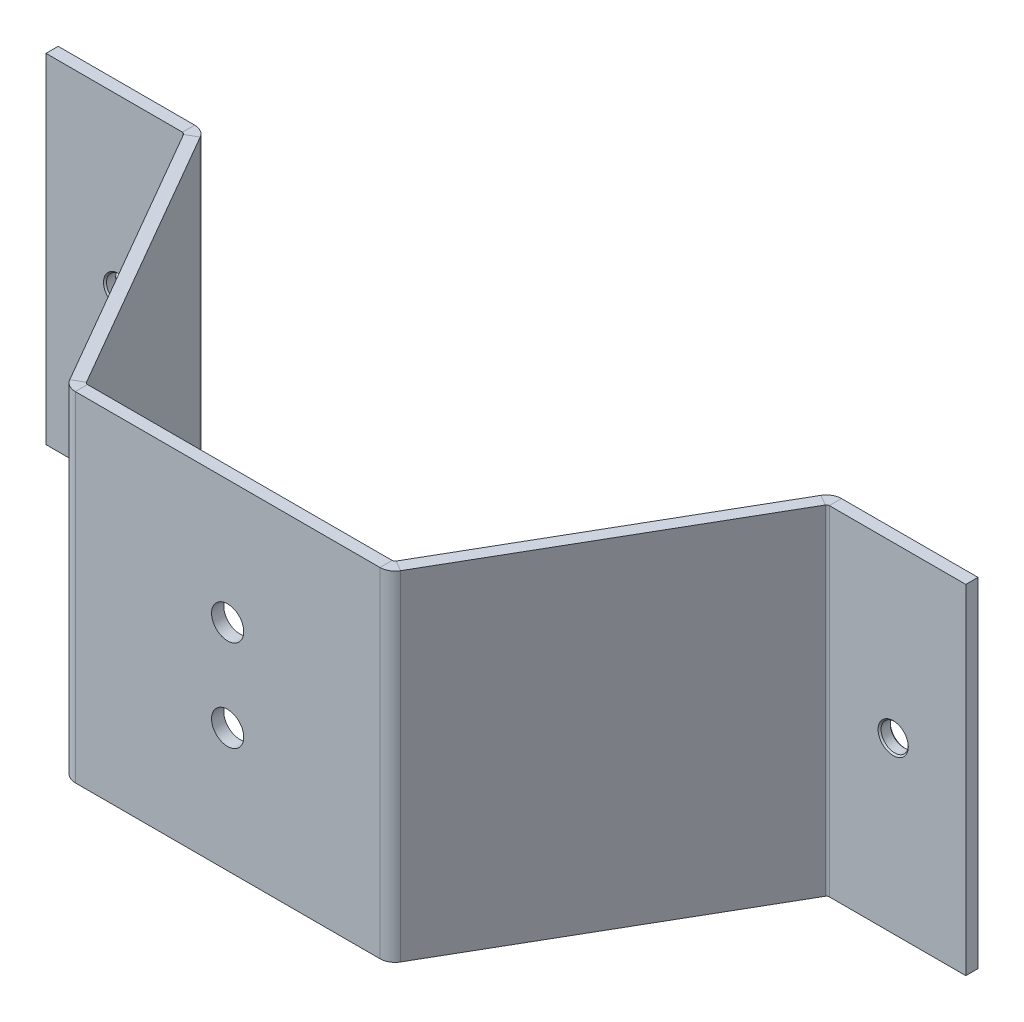
ISO-10303-21;
HEADER;
FILE_DESCRIPTION(('STEP AP214'),'2;1');
FILE_NAME('part.step','',(''),(''),'','','');
FILE_SCHEMA(('AUTOMOTIVE_DESIGN { 1 0 10303 214 1 1 1 1 }'));
ENDSEC;
DATA;
#1=APPLICATION_CONTEXT('core data for automotive mechanical design processes');
#2=APPLICATION_PROTOCOL_DEFINITION('international standard','automotive_design',2000,#1);
#3=PRODUCT_CONTEXT('',#1,'mechanical');
#4=PRODUCT('Part','Part','',(#3));
#5=PRODUCT_RELATED_PRODUCT_CATEGORY('part','',(#4));
#6=PRODUCT_DEFINITION_FORMATION('','',#4);
#7=PRODUCT_DEFINITION_CONTEXT('part definition',#1,'design');
#8=PRODUCT_DEFINITION('design','',#6,#7);
#9=PRODUCT_DEFINITION_SHAPE('','',#8);
#10=(LENGTH_UNIT() NAMED_UNIT(*) SI_UNIT(.MILLI.,.METRE.));
#11=(NAMED_UNIT(*) PLANE_ANGLE_UNIT() SI_UNIT($,.RADIAN.));
#12=(NAMED_UNIT(*) SI_UNIT($,.STERADIAN.) SOLID_ANGLE_UNIT());
#13=UNCERTAINTY_MEASURE_WITH_UNIT(LENGTH_MEASURE(1.E-05),#10,'distance_accuracy_value','');
#14=(GEOMETRIC_REPRESENTATION_CONTEXT(3) GLOBAL_UNCERTAINTY_ASSIGNED_CONTEXT((#13)) GLOBAL_UNIT_ASSIGNED_CONTEXT((#10,
#11,#12)) REPRESENTATION_CONTEXT('',''));
#15=CARTESIAN_POINT('',(0.,0.,0.));
#16=DIRECTION('',(0.,0.,1.));
#17=DIRECTION('',(1.,0.,0.));
#18=AXIS2_PLACEMENT_3D('',#15,#16,#17);
#19=CARTESIAN_POINT('',(20.2018306446326,22.225,38.1));
#20=DIRECTION('',(0.,0.,-1.));
#21=DIRECTION('',(-1.,0.,0.));
#22=AXIS2_PLACEMENT_3D('',#19,#20,#21);
#23=PLANE('',#22);
#24=CARTESIAN_POINT('',(0.,5.9944,38.1));
#25=DIRECTION('',(0.,0.,1.));
#26=DIRECTION('',(1.,0.,0.));
#27=AXIS2_PLACEMENT_3D('',#24,#25,#26);
#28=CIRCLE('',#27,2.1082);
#29=CARTESIAN_POINT('',(2.1082,5.9944,38.1));
#30=VERTEX_POINT('',#29);
#31=EDGE_CURVE('E1095',#30,#30,#28,.T.);
#32=ORIENTED_EDGE('',*,*,#31,.F.);
#33=EDGE_LOOP('',(#32));
#34=FACE_BOUND('',#33,.T.);
#35=DIRECTION('',(1.,0.,0.));
#36=VECTOR('',#35,1.);
#37=CARTESIAN_POINT('',(20.2018306446326,-22.225,38.1));
#38=LINE('',#37,#36);
#39=CARTESIAN_POINT('',(-19.9818601920714,-22.225,38.1));
#40=VERTEX_POINT('',#39);
#41=CARTESIAN_POINT('',(19.9818601920714,-22.225,38.1));
#42=VERTEX_POINT('',#41);
#43=EDGE_CURVE('E274',#40,#42,#38,.T.);
#44=ORIENTED_EDGE('',*,*,#43,.T.);
#45=DIRECTION('',(0.,-1.,0.));
#46=VECTOR('',#45,1.);
#47=CARTESIAN_POINT('',(19.9818601920714,22.225,38.1));
#48=LINE('',#47,#46);
#49=CARTESIAN_POINT('',(19.9818601920714,22.225,38.1));
#50=VERTEX_POINT('',#49);
#51=EDGE_CURVE('E215',#50,#42,#48,.T.);
#52=ORIENTED_EDGE('',*,*,#51,.F.);
#53=DIRECTION('',(1.,0.,0.));
#54=VECTOR('',#53,1.);
#55=CARTESIAN_POINT('',(20.2018306446326,22.225,38.1));
#56=LINE('',#55,#54);
#57=CARTESIAN_POINT('',(-19.9818601920714,22.225,38.1));
#58=VERTEX_POINT('',#57);
#59=EDGE_CURVE('E206',#58,#50,#56,.T.);
#60=ORIENTED_EDGE('',*,*,#59,.F.);
#61=DIRECTION('',(0.,-1.,0.));
#62=VECTOR('',#61,1.);
#63=CARTESIAN_POINT('',(-19.9818601920714,22.225,38.1));
#64=LINE('',#63,#62);
#65=EDGE_CURVE('E286',#58,#40,#64,.T.);
#66=ORIENTED_EDGE('',*,*,#65,.T.);
#67=EDGE_LOOP('',(#44,#52,#60,#66));
#68=FACE_BOUND('',#67,.T.);
#69=CARTESIAN_POINT('',(0.,-5.9944,38.1));
#70=DIRECTION('',(0.,0.,1.));
#71=DIRECTION('',(1.,0.,0.));
#72=AXIS2_PLACEMENT_3D('',#69,#70,#71);
#73=CIRCLE('',#72,2.1082);
#74=CARTESIAN_POINT('',(2.1082,-5.9944,38.1));
#75=VERTEX_POINT('',#74);
#76=EDGE_CURVE('E1099',#75,#75,#73,.T.);
#77=ORIENTED_EDGE('',*,*,#76,.F.);
#78=EDGE_LOOP('',(#77));
#79=FACE_BOUND('',#78,.T.);
#80=ADVANCED_FACE('F40',(#34,#68,#79),#23,.F.);
#81=CARTESIAN_POINT('',(42.4188463533185,22.225,0.));
#82=DIRECTION('',(0.,1.,0.));
#83=DIRECTION('',(0.,0.,1.));
#84=AXIS2_PLACEMENT_3D('',#81,#82,#83);
#85=PLANE('',#84);
#86=DIRECTION('',(0.,0.,1.));
#87=VECTOR('',#86,1.);
#88=CARTESIAN_POINT('',(42.4188463533185,22.225,0.));
#89=LINE('',#88,#87);
#90=CARTESIAN_POINT('',(42.4188463533185,22.225,0.));
#91=VERTEX_POINT('',#90);
#92=CARTESIAN_POINT('',(42.4188463533185,22.225,1.60020000000001));
#93=VERTEX_POINT('',#92);
#94=EDGE_CURVE('E11',#91,#93,#89,.T.);
#95=ORIENTED_EDGE('',*,*,#94,.F.);
#96=CARTESIAN_POINT('',(42.4188463533185,22.225,1.98120000000001));
#97=DIRECTION('',(0.,-1.,0.));
#98=DIRECTION('',(0.,0.,-1.));
#99=AXIS2_PLACEMENT_3D('',#96,#97,#98);
#100=CIRCLE('',#99,1.9812);
#101=CARTESIAN_POINT('',(40.7030768233408,22.225,0.99060000000001));
#102=VERTEX_POINT('',#101);
#103=EDGE_CURVE('E359',#102,#91,#100,.T.);
#104=ORIENTED_EDGE('',*,*,#103,.F.);
#105=DIRECTION('',(-0.866025403784439,0.,-0.499999999999999));
#106=VECTOR('',#105,1.);
#107=CARTESIAN_POINT('',(42.0888906744766,22.225,1.79070000000001));
#108=LINE('',#107,#106);
#109=CARTESIAN_POINT('',(42.0888906744766,22.225,1.79070000000001));
#110=VERTEX_POINT('',#109);
#111=EDGE_CURVE('E49',#110,#102,#108,.T.);
#112=ORIENTED_EDGE('',*,*,#111,.F.);
#113=CARTESIAN_POINT('',(42.4188463533185,22.225,1.98120000000001));
#114=DIRECTION('',(0.,1.,0.));
#115=DIRECTION('',(1.,0.,0.));
#116=AXIS2_PLACEMENT_3D('',#113,#114,#115);
#117=CIRCLE('',#116,0.381);
#118=EDGE_CURVE('E221',#110,#93,#117,.F.);
#119=ORIENTED_EDGE('',*,*,#118,.T.);
#120=EDGE_LOOP('',(#95,#104,#112,#119));
#121=FACE_BOUND('',#120,.T.);
#122=ADVANCED_FACE('F42',(#121),#85,.T.);
#123=CARTESIAN_POINT('',(42.0888906744766,22.225,1.79070000000001));
#124=DIRECTION('',(0.,1.,0.));
#125=DIRECTION('',(0.,0.,1.));
#126=AXIS2_PLACEMENT_3D('',#123,#124,#125);
#127=PLANE('',#126);
#128=DIRECTION('',(1.,0.,0.));
#129=VECTOR('',#128,1.);
#130=CARTESIAN_POINT('',(60.325,22.225,0.));
#131=LINE('',#130,#129);
#132=CARTESIAN_POINT('',(60.325,22.225,0.));
#133=VERTEX_POINT('',#132);
#134=EDGE_CURVE('E363',#91,#133,#131,.T.);
#135=ORIENTED_EDGE('',*,*,#134,.F.);
#136=ORIENTED_EDGE('',*,*,#94,.T.);
#137=DIRECTION('',(1.,0.,0.));
#138=VECTOR('',#137,1.);
#139=CARTESIAN_POINT('',(60.325,22.225,1.60020000000001));
#140=LINE('',#139,#138);
#141=CARTESIAN_POINT('',(60.325,22.225,1.60020000000001));
#142=VERTEX_POINT('',#141);
#143=EDGE_CURVE('E133',#93,#142,#140,.T.);
#144=ORIENTED_EDGE('',*,*,#143,.T.);
#145=DIRECTION('',(0.,0.,1.));
#146=VECTOR('',#145,1.);
#147=CARTESIAN_POINT('',(60.325,22.225,0.));
#148=LINE('',#147,#146);
#149=EDGE_CURVE('E556',#133,#142,#148,.T.);
#150=ORIENTED_EDGE('',*,*,#149,.F.);
#151=EDGE_LOOP('',(#135,#136,#144,#150));
#152=FACE_BOUND('',#151,.T.);
#153=ADVANCED_FACE('F501',(#152),#127,.T.);
#154=CARTESIAN_POINT('',(40.7030768233408,-22.225,0.99060000000001));
#155=DIRECTION('',(0.,-1.,0.));
#156=DIRECTION('',(0.,0.,-1.));
#157=AXIS2_PLACEMENT_3D('',#154,#155,#156);
#158=PLANE('',#157);
#159=DIRECTION('',(0.866025403784439,0.,0.499999999999999));
#160=VECTOR('',#159,1.);
#161=CARTESIAN_POINT('',(40.7030768233408,-22.225,0.99060000000001));
#162=LINE('',#161,#160);
#163=CARTESIAN_POINT('',(40.7030768233408,-22.225,0.99060000000001));
#164=VERTEX_POINT('',#163);
#165=CARTESIAN_POINT('',(42.0888906744766,-22.225,1.79070000000001));
#166=VERTEX_POINT('',#165);
#167=EDGE_CURVE('E120',#164,#166,#162,.T.);
#168=ORIENTED_EDGE('',*,*,#167,.F.);
#169=CARTESIAN_POINT('',(42.4188463533185,-22.225,1.98120000000001));
#170=DIRECTION('',(0.,-1.,0.));
#171=DIRECTION('',(0.,0.,-1.));
#172=AXIS2_PLACEMENT_3D('',#169,#170,#171);
#173=CIRCLE('',#172,1.9812);
#174=CARTESIAN_POINT('',(42.4188463533185,-22.225,0.));
#175=VERTEX_POINT('',#174);
#176=EDGE_CURVE('E237',#164,#175,#173,.T.);
#177=ORIENTED_EDGE('',*,*,#176,.T.);
#178=DIRECTION('',(0.,0.,-1.));
#179=VECTOR('',#178,1.);
#180=CARTESIAN_POINT('',(42.4188463533185,-22.225,1.60020000000001));
#181=LINE('',#180,#179);
#182=CARTESIAN_POINT('',(42.4188463533185,-22.225,1.60020000000001));
#183=VERTEX_POINT('',#182);
#184=EDGE_CURVE('E127',#183,#175,#181,.T.);
#185=ORIENTED_EDGE('',*,*,#184,.F.);
#186=CARTESIAN_POINT('',(42.4188463533185,-22.225,1.98120000000001));
#187=DIRECTION('',(0.,1.,0.));
#188=DIRECTION('',(1.,0.,0.));
#189=AXIS2_PLACEMENT_3D('',#186,#187,#188);
#190=CIRCLE('',#189,0.381);
#191=EDGE_CURVE('E280',#166,#183,#190,.F.);
#192=ORIENTED_EDGE('',*,*,#191,.F.);
#193=EDGE_LOOP('',(#168,#177,#185,#192));
#194=FACE_BOUND('',#193,.T.);
#195=ADVANCED_FACE('F551',(#194),#158,.T.);
#196=CARTESIAN_POINT('',(42.4188463533185,-22.225,1.60020000000001));
#197=DIRECTION('',(0.,-1.,0.));
#198=DIRECTION('',(0.,0.,-1.));
#199=AXIS2_PLACEMENT_3D('',#196,#197,#198);
#200=PLANE('',#199);
#201=DIRECTION('',(0.499999999999998,0.,-0.86602540378444));
#202=VECTOR('',#201,1.);
#203=CARTESIAN_POINT('',(41.275,-22.225,0.));
#204=LINE('',#203,#202);
#205=CARTESIAN_POINT('',(20.3118158709133,-22.225,36.3093));
#206=VERTEX_POINT('',#205);
#207=EDGE_CURVE('E239',#206,#164,#204,.T.);
#208=ORIENTED_EDGE('',*,*,#207,.T.);
#209=ORIENTED_EDGE('',*,*,#167,.T.);
#210=DIRECTION('',(0.499999999999998,0.,-0.86602540378444));
#211=VECTOR('',#210,1.);
#212=CARTESIAN_POINT('',(42.6608138511359,-22.225,0.800100000000006));
#213=LINE('',#212,#211);
#214=CARTESIAN_POINT('',(21.6976297220491,-22.225,37.1094));
#215=VERTEX_POINT('',#214);
#216=EDGE_CURVE('E278',#215,#166,#213,.T.);
#217=ORIENTED_EDGE('',*,*,#216,.F.);
#218=DIRECTION('',(-0.86602540378444,0.,-0.499999999999998));
#219=VECTOR('',#218,1.);
#220=CARTESIAN_POINT('',(21.6976297220491,-22.225,37.1094));
#221=LINE('',#220,#219);
#222=EDGE_CURVE('E346',#215,#206,#221,.T.);
#223=ORIENTED_EDGE('',*,*,#222,.T.);
#224=EDGE_LOOP('',(#208,#209,#217,#223));
#225=FACE_BOUND('',#224,.T.);
#226=ADVANCED_FACE('F416',(#225),#200,.T.);
#227=CARTESIAN_POINT('',(20.3118158709133,22.225,36.3093));
#228=DIRECTION('',(0.,1.,0.));
#229=DIRECTION('',(0.,0.,1.));
#230=AXIS2_PLACEMENT_3D('',#227,#228,#229);
#231=PLANE('',#230);
#232=DIRECTION('',(0.86602540378444,0.,0.499999999999998));
#233=VECTOR('',#232,1.);
#234=CARTESIAN_POINT('',(20.3118158709133,22.225,36.3093));
#235=LINE('',#234,#233);
#236=CARTESIAN_POINT('',(20.3118158709133,22.225,36.3093));
#237=VERTEX_POINT('',#236);
#238=CARTESIAN_POINT('',(21.6976297220491,22.225,37.1094));
#239=VERTEX_POINT('',#238);
#240=EDGE_CURVE('E185',#237,#239,#235,.T.);
#241=ORIENTED_EDGE('',*,*,#240,.F.);
#242=CARTESIAN_POINT('',(19.9818601920714,22.225,36.1188));
#243=DIRECTION('',(0.,1.,0.));
#244=DIRECTION('',(0.,0.,1.));
#245=AXIS2_PLACEMENT_3D('',#242,#243,#244);
#246=CIRCLE('',#245,0.381);
#247=CARTESIAN_POINT('',(19.9818601920714,22.225,36.4998));
#248=VERTEX_POINT('',#247);
#249=EDGE_CURVE('E366',#248,#237,#246,.T.);
#250=ORIENTED_EDGE('',*,*,#249,.F.);
#251=DIRECTION('',(0.,0.,-1.));
#252=VECTOR('',#251,1.);
#253=CARTESIAN_POINT('',(19.9818601920714,22.225,38.1));
#254=LINE('',#253,#252);
#255=EDGE_CURVE('E197',#50,#248,#254,.T.);
#256=ORIENTED_EDGE('',*,*,#255,.F.);
#257=CARTESIAN_POINT('',(19.9818601920714,22.225,36.1188));
#258=DIRECTION('',(0.,1.,0.));
#259=DIRECTION('',(1.,0.,0.));
#260=AXIS2_PLACEMENT_3D('',#257,#258,#259);
#261=CIRCLE('',#260,1.9812);
#262=EDGE_CURVE('E200',#50,#239,#261,.T.);
#263=ORIENTED_EDGE('',*,*,#262,.T.);
#264=EDGE_LOOP('',(#241,#250,#256,#263));
#265=FACE_BOUND('',#264,.T.);
#266=ADVANCED_FACE('F202',(#265),#231,.T.);
#267=CARTESIAN_POINT('',(19.9818601920714,22.225,38.1));
#268=DIRECTION('',(0.,1.,0.));
#269=DIRECTION('',(0.,0.,1.));
#270=AXIS2_PLACEMENT_3D('',#267,#268,#269);
#271=PLANE('',#270);
#272=DIRECTION('',(0.499999999999998,0.,-0.86602540378444));
#273=VECTOR('',#272,1.);
#274=CARTESIAN_POINT('',(41.275,22.225,0.));
#275=LINE('',#274,#273);
#276=EDGE_CURVE('E192',#237,#102,#275,.T.);
#277=ORIENTED_EDGE('',*,*,#276,.F.);
#278=ORIENTED_EDGE('',*,*,#240,.T.);
#279=DIRECTION('',(0.499999999999998,0.,-0.86602540378444));
#280=VECTOR('',#279,1.);
#281=CARTESIAN_POINT('',(42.6608138511359,22.225,0.800100000000006));
#282=LINE('',#281,#280);
#283=EDGE_CURVE('E189',#239,#110,#282,.T.);
#284=ORIENTED_EDGE('',*,*,#283,.T.);
#285=ORIENTED_EDGE('',*,*,#111,.T.);
#286=EDGE_LOOP('',(#277,#278,#284,#285));
#287=FACE_BOUND('',#286,.T.);
#288=ADVANCED_FACE('F187',(#287),#271,.T.);
#289=CARTESIAN_POINT('',(19.9818601920714,-22.225,36.4998));
#290=DIRECTION('',(0.,-1.,0.));
#291=DIRECTION('',(0.,0.,-1.));
#292=AXIS2_PLACEMENT_3D('',#289,#290,#291);
#293=PLANE('',#292);
#294=DIRECTION('',(0.,0.,1.));
#295=VECTOR('',#294,1.);
#296=CARTESIAN_POINT('',(19.9818601920714,-22.225,36.4998));
#297=LINE('',#296,#295);
#298=CARTESIAN_POINT('',(19.9818601920714,-22.225,36.4998));
#299=VERTEX_POINT('',#298);
#300=EDGE_CURVE('E348',#299,#42,#297,.T.);
#301=ORIENTED_EDGE('',*,*,#300,.F.);
#302=CARTESIAN_POINT('',(19.9818601920714,-22.225,36.1188));
#303=DIRECTION('',(0.,1.,0.));
#304=DIRECTION('',(0.,0.,1.));
#305=AXIS2_PLACEMENT_3D('',#302,#303,#304);
#306=CIRCLE('',#305,0.381);
#307=EDGE_CURVE('E241',#299,#206,#306,.T.);
#308=ORIENTED_EDGE('',*,*,#307,.T.);
#309=ORIENTED_EDGE('',*,*,#222,.F.);
#310=CARTESIAN_POINT('',(19.9818601920714,-22.225,36.1188));
#311=DIRECTION('',(0.,1.,0.));
#312=DIRECTION('',(1.,0.,0.));
#313=AXIS2_PLACEMENT_3D('',#310,#311,#312);
#314=CIRCLE('',#313,1.9812);
#315=EDGE_CURVE('E213',#42,#215,#314,.T.);
#316=ORIENTED_EDGE('',*,*,#315,.F.);
#317=EDGE_LOOP('',(#301,#308,#309,#316));
#318=FACE_BOUND('',#317,.T.);
#319=ADVANCED_FACE('F414',(#318),#293,.T.);
#320=CARTESIAN_POINT('',(21.6976297220491,-22.225,37.1094));
#321=DIRECTION('',(0.,-1.,0.));
#322=DIRECTION('',(0.,0.,-1.));
#323=AXIS2_PLACEMENT_3D('',#320,#321,#322);
#324=PLANE('',#323);
#325=DIRECTION('',(1.,0.,0.));
#326=VECTOR('',#325,1.);
#327=CARTESIAN_POINT('',(20.2018306446326,-22.225,36.4998));
#328=LINE('',#327,#326);
#329=CARTESIAN_POINT('',(-19.9818601920714,-22.225,36.4998));
#330=VERTEX_POINT('',#329);
#331=EDGE_CURVE('E244',#330,#299,#328,.T.);
#332=ORIENTED_EDGE('',*,*,#331,.T.);
#333=ORIENTED_EDGE('',*,*,#300,.T.);
#334=ORIENTED_EDGE('',*,*,#43,.F.);
#335=DIRECTION('',(0.,0.,-1.));
#336=VECTOR('',#335,1.);
#337=CARTESIAN_POINT('',(-19.9818601920714,-22.225,38.1));
#338=LINE('',#337,#336);
#339=EDGE_CURVE('E338',#40,#330,#338,.T.);
#340=ORIENTED_EDGE('',*,*,#339,.T.);
#341=EDGE_LOOP('',(#332,#333,#334,#340));
#342=FACE_BOUND('',#341,.T.);
#343=ADVANCED_FACE('F475',(#342),#324,.T.);
#344=CARTESIAN_POINT('',(-19.9818601920714,22.225,36.4998));
#345=DIRECTION('',(0.,1.,0.));
#346=DIRECTION('',(0.,0.,1.));
#347=AXIS2_PLACEMENT_3D('',#344,#345,#346);
#348=PLANE('',#347);
#349=DIRECTION('',(0.,0.,1.));
#350=VECTOR('',#349,1.);
#351=CARTESIAN_POINT('',(-19.9818601920714,22.225,36.4998));
#352=LINE('',#351,#350);
#353=CARTESIAN_POINT('',(-19.9818601920714,22.225,36.4998));
#354=VERTEX_POINT('',#353);
#355=EDGE_CURVE('E344',#354,#58,#352,.T.);
#356=ORIENTED_EDGE('',*,*,#355,.F.);
#357=CARTESIAN_POINT('',(-19.9818601920714,22.225,36.1188));
#358=DIRECTION('',(0.,1.,0.));
#359=DIRECTION('',(0.,0.,1.));
#360=AXIS2_PLACEMENT_3D('',#357,#358,#359);
#361=CIRCLE('',#360,0.381);
#362=CARTESIAN_POINT('',(-20.3118158709133,22.225,36.3093));
#363=VERTEX_POINT('',#362);
#364=EDGE_CURVE('E374',#363,#354,#361,.T.);
#365=ORIENTED_EDGE('',*,*,#364,.F.);
#366=DIRECTION('',(0.866025403784422,0.,-0.500000000000028));
#367=VECTOR('',#366,1.);
#368=CARTESIAN_POINT('',(-21.6976297220491,22.225,37.1094000000001));
#369=LINE('',#368,#367);
#370=CARTESIAN_POINT('',(-21.6976297220491,22.225,37.1094000000001));
#371=VERTEX_POINT('',#370);
#372=EDGE_CURVE('E342',#371,#363,#369,.T.);
#373=ORIENTED_EDGE('',*,*,#372,.F.);
#374=CARTESIAN_POINT('',(-19.9818601920714,22.225,36.1188));
#375=DIRECTION('',(0.,1.,0.));
#376=DIRECTION('',(1.,0.,0.));
#377=AXIS2_PLACEMENT_3D('',#374,#375,#376);
#378=CIRCLE('',#377,1.9812);
#379=EDGE_CURVE('E398',#371,#58,#378,.T.);
#380=ORIENTED_EDGE('',*,*,#379,.T.);
#381=EDGE_LOOP('',(#356,#365,#373,#380));
#382=FACE_BOUND('',#381,.T.);
#383=ADVANCED_FACE('F429',(#382),#348,.T.);
#384=CARTESIAN_POINT('',(-21.6976297220491,22.225,37.1094000000001));
#385=DIRECTION('',(0.,1.,0.));
#386=DIRECTION('',(0.,0.,1.));
#387=AXIS2_PLACEMENT_3D('',#384,#385,#386);
#388=PLANE('',#387);
#389=DIRECTION('',(1.,0.,0.));
#390=VECTOR('',#389,1.);
#391=CARTESIAN_POINT('',(20.2018306446326,22.225,36.4998));
#392=LINE('',#391,#390);
#393=EDGE_CURVE('E368',#354,#248,#392,.T.);
#394=ORIENTED_EDGE('',*,*,#393,.F.);
#395=ORIENTED_EDGE('',*,*,#355,.T.);
#396=ORIENTED_EDGE('',*,*,#59,.T.);
#397=ORIENTED_EDGE('',*,*,#255,.T.);
#398=EDGE_LOOP('',(#394,#395,#396,#397));
#399=FACE_BOUND('',#398,.T.);
#400=ADVANCED_FACE('F408',(#399),#388,.T.);
#401=CARTESIAN_POINT('',(-20.3118158709133,-22.225,36.3093));
#402=DIRECTION('',(0.,-1.,0.));
#403=DIRECTION('',(0.,0.,-1.));
#404=AXIS2_PLACEMENT_3D('',#401,#402,#403);
#405=PLANE('',#404);
#406=DIRECTION('',(-0.866025403784422,0.,0.500000000000028));
#407=VECTOR('',#406,1.);
#408=CARTESIAN_POINT('',(-20.3118158709133,-22.225,36.3093));
#409=LINE('',#408,#407);
#410=CARTESIAN_POINT('',(-20.3118158709133,-22.225,36.3093));
#411=VERTEX_POINT('',#410);
#412=CARTESIAN_POINT('',(-21.6976297220491,-22.225,37.1094000000001));
#413=VERTEX_POINT('',#412);
#414=EDGE_CURVE('E340',#411,#413,#409,.T.);
#415=ORIENTED_EDGE('',*,*,#414,.F.);
#416=CARTESIAN_POINT('',(-19.9818601920714,-22.225,36.1188));
#417=DIRECTION('',(0.,1.,0.));
#418=DIRECTION('',(0.,0.,1.));
#419=AXIS2_PLACEMENT_3D('',#416,#417,#418);
#420=CIRCLE('',#419,0.381);
#421=EDGE_CURVE('E247',#411,#330,#420,.T.);
#422=ORIENTED_EDGE('',*,*,#421,.T.);
#423=ORIENTED_EDGE('',*,*,#339,.F.);
#424=CARTESIAN_POINT('',(-19.9818601920714,-22.225,36.1188));
#425=DIRECTION('',(0.,1.,0.));
#426=DIRECTION('',(1.,0.,0.));
#427=AXIS2_PLACEMENT_3D('',#424,#425,#426);
#428=CIRCLE('',#427,1.9812);
#429=EDGE_CURVE('E271',#413,#40,#428,.T.);
#430=ORIENTED_EDGE('',*,*,#429,.F.);
#431=EDGE_LOOP('',(#415,#422,#423,#430));
#432=FACE_BOUND('',#431,.T.);
#433=ADVANCED_FACE('F477',(#432),#405,.T.);
#434=CARTESIAN_POINT('',(-19.9818601920714,-22.225,38.1));
#435=DIRECTION('',(0.,-1.,0.));
#436=DIRECTION('',(0.,0.,-1.));
#437=AXIS2_PLACEMENT_3D('',#434,#435,#436);
#438=PLANE('',#437);
#439=DIRECTION('',(0.499999999999998,0.,0.86602540378444));
#440=VECTOR('',#439,1.);
#441=CARTESIAN_POINT('',(-41.275,-22.225,0.));
#442=LINE('',#441,#440);
#443=CARTESIAN_POINT('',(-40.7030768233408,-22.225,0.99060000000001));
#444=VERTEX_POINT('',#443);
#445=EDGE_CURVE('E250',#444,#411,#442,.T.);
#446=ORIENTED_EDGE('',*,*,#445,.T.);
#447=ORIENTED_EDGE('',*,*,#414,.T.);
#448=DIRECTION('',(0.499999999999998,0.,0.86602540378444));
#449=VECTOR('',#448,1.);
#450=CARTESIAN_POINT('',(-42.6608138511359,-22.225,0.800100000000006));
#451=LINE('',#450,#449);
#452=CARTESIAN_POINT('',(-42.0888906744766,-22.225,1.79070000000001));
#453=VERTEX_POINT('',#452);
#454=EDGE_CURVE('E268',#453,#413,#451,.T.);
#455=ORIENTED_EDGE('',*,*,#454,.F.);
#456=DIRECTION('',(0.86602540378444,0.,-0.499999999999997));
#457=VECTOR('',#456,1.);
#458=CARTESIAN_POINT('',(-42.0888906744766,-22.225,1.79070000000001));
#459=LINE('',#458,#457);
#460=EDGE_CURVE('E330',#453,#444,#459,.T.);
#461=ORIENTED_EDGE('',*,*,#460,.T.);
#462=EDGE_LOOP('',(#446,#447,#455,#461));
#463=FACE_BOUND('',#462,.T.);
#464=ADVANCED_FACE('F479',(#463),#438,.T.);
#465=CARTESIAN_POINT('',(-40.7030768233408,22.225,0.99060000000001));
#466=DIRECTION('',(0.,1.,0.));
#467=DIRECTION('',(0.,0.,1.));
#468=AXIS2_PLACEMENT_3D('',#465,#466,#467);
#469=PLANE('',#468);
#470=DIRECTION('',(-0.86602540378444,0.,0.499999999999997));
#471=VECTOR('',#470,1.);
#472=CARTESIAN_POINT('',(-40.7030768233408,22.225,0.99060000000001));
#473=LINE('',#472,#471);
#474=CARTESIAN_POINT('',(-40.7030768233408,22.225,0.99060000000001));
#475=VERTEX_POINT('',#474);
#476=CARTESIAN_POINT('',(-42.0888906744766,22.225,1.79070000000001));
#477=VERTEX_POINT('',#476);
#478=EDGE_CURVE('E336',#475,#477,#473,.T.);
#479=ORIENTED_EDGE('',*,*,#478,.F.);
#480=CARTESIAN_POINT('',(-42.4188463533185,22.225,1.98120000000001));
#481=DIRECTION('',(0.,-1.,0.));
#482=DIRECTION('',(0.,0.,-1.));
#483=AXIS2_PLACEMENT_3D('',#480,#481,#482);
#484=CIRCLE('',#483,1.9812);
#485=CARTESIAN_POINT('',(-42.4188463533185,22.225,0.));
#486=VERTEX_POINT('',#485);
#487=EDGE_CURVE('E380',#486,#475,#484,.T.);
#488=ORIENTED_EDGE('',*,*,#487,.F.);
#489=DIRECTION('',(0.,0.,-1.));
#490=VECTOR('',#489,1.);
#491=CARTESIAN_POINT('',(-42.4188463533185,22.225,1.60020000000001));
#492=LINE('',#491,#490);
#493=CARTESIAN_POINT('',(-42.4188463533185,22.225,1.60020000000001));
#494=VERTEX_POINT('',#493);
#495=EDGE_CURVE('E334',#494,#486,#492,.T.);
#496=ORIENTED_EDGE('',*,*,#495,.F.);
#497=CARTESIAN_POINT('',(-42.4188463533185,22.225,1.98120000000001));
#498=DIRECTION('',(0.,1.,0.));
#499=DIRECTION('',(1.,0.,0.));
#500=AXIS2_PLACEMENT_3D('',#497,#498,#499);
#501=CIRCLE('',#500,0.381);
#502=EDGE_CURVE('E392',#494,#477,#501,.F.);
#503=ORIENTED_EDGE('',*,*,#502,.T.);
#504=EDGE_LOOP('',(#479,#488,#496,#503));
#505=FACE_BOUND('',#504,.T.);
#506=ADVANCED_FACE('F443',(#505),#469,.T.);
#507=CARTESIAN_POINT('',(-42.4188463533185,22.225,1.60020000000001));
#508=DIRECTION('',(0.,1.,0.));
#509=DIRECTION('',(0.,0.,1.));
#510=AXIS2_PLACEMENT_3D('',#507,#508,#509);
#511=PLANE('',#510);
#512=DIRECTION('',(0.499999999999998,0.,0.86602540378444));
#513=VECTOR('',#512,1.);
#514=CARTESIAN_POINT('',(-41.275,22.225,0.));
#515=LINE('',#514,#513);
#516=EDGE_CURVE('E377',#475,#363,#515,.T.);
#517=ORIENTED_EDGE('',*,*,#516,.F.);
#518=ORIENTED_EDGE('',*,*,#478,.T.);
#519=DIRECTION('',(0.499999999999998,0.,0.86602540378444));
#520=VECTOR('',#519,1.);
#521=CARTESIAN_POINT('',(-42.6608138511359,22.225,0.800100000000006));
#522=LINE('',#521,#520);
#523=EDGE_CURVE('E395',#477,#371,#522,.T.);
#524=ORIENTED_EDGE('',*,*,#523,.T.);
#525=ORIENTED_EDGE('',*,*,#372,.T.);
#526=EDGE_LOOP('',(#517,#518,#524,#525));
#527=FACE_BOUND('',#526,.T.);
#528=ADVANCED_FACE('F436',(#527),#511,.T.);
#529=CARTESIAN_POINT('',(-42.4188463533185,-22.225,0.));
#530=DIRECTION('',(0.,-1.,0.));
#531=DIRECTION('',(0.,0.,-1.));
#532=AXIS2_PLACEMENT_3D('',#529,#530,#531);
#533=PLANE('',#532);
#534=DIRECTION('',(0.,0.,1.));
#535=VECTOR('',#534,1.);
#536=CARTESIAN_POINT('',(-42.4188463533185,-22.225,0.));
#537=LINE('',#536,#535);
#538=CARTESIAN_POINT('',(-42.4188463533185,-22.225,0.));
#539=VERTEX_POINT('',#538);
#540=CARTESIAN_POINT('',(-42.4188463533185,-22.225,1.60020000000001));
#541=VERTEX_POINT('',#540);
#542=EDGE_CURVE('E332',#539,#541,#537,.T.);
#543=ORIENTED_EDGE('',*,*,#542,.F.);
#544=CARTESIAN_POINT('',(-42.4188463533185,-22.225,1.98120000000001));
#545=DIRECTION('',(0.,-1.,0.));
#546=DIRECTION('',(0.,0.,-1.));
#547=AXIS2_PLACEMENT_3D('',#544,#545,#546);
#548=CIRCLE('',#547,1.9812);
#549=EDGE_CURVE('E253',#539,#444,#548,.T.);
#550=ORIENTED_EDGE('',*,*,#549,.T.);
#551=ORIENTED_EDGE('',*,*,#460,.F.);
#552=CARTESIAN_POINT('',(-42.4188463533185,-22.225,1.98120000000001));
#553=DIRECTION('',(0.,1.,0.));
#554=DIRECTION('',(1.,0.,0.));
#555=AXIS2_PLACEMENT_3D('',#552,#553,#554);
#556=CIRCLE('',#555,0.381);
#557=EDGE_CURVE('E265',#541,#453,#556,.F.);
#558=ORIENTED_EDGE('',*,*,#557,.F.);
#559=EDGE_LOOP('',(#543,#550,#551,#558));
#560=FACE_BOUND('',#559,.T.);
#561=ADVANCED_FACE('F481',(#560),#533,.T.);
#562=CARTESIAN_POINT('',(-42.0888906744766,-22.225,1.79070000000001));
#563=DIRECTION('',(0.,-1.,0.));
#564=DIRECTION('',(0.,0.,-1.));
#565=AXIS2_PLACEMENT_3D('',#562,#563,#564);
#566=PLANE('',#565);
#567=DIRECTION('',(1.,0.,0.));
#568=VECTOR('',#567,1.);
#569=CARTESIAN_POINT('',(-60.325,-22.225,0.));
#570=LINE('',#569,#568);
#571=CARTESIAN_POINT('',(-60.325,-22.225,0.));
#572=VERTEX_POINT('',#571);
#573=EDGE_CURVE('E256',#572,#539,#570,.T.);
#574=ORIENTED_EDGE('',*,*,#573,.T.);
#575=ORIENTED_EDGE('',*,*,#542,.T.);
#576=DIRECTION('',(1.,0.,0.));
#577=VECTOR('',#576,1.);
#578=CARTESIAN_POINT('',(-60.325,-22.225,1.60020000000001));
#579=LINE('',#578,#577);
#580=CARTESIAN_POINT('',(-60.325,-22.225,1.60020000000001));
#581=VERTEX_POINT('',#580);
#582=EDGE_CURVE('E262',#581,#541,#579,.T.);
#583=ORIENTED_EDGE('',*,*,#582,.F.);
#584=DIRECTION('',(0.,0.,-1.));
#585=VECTOR('',#584,1.);
#586=CARTESIAN_POINT('',(-60.325,-22.225,1.60020000000001));
#587=LINE('',#586,#585);
#588=EDGE_CURVE('E259',#581,#572,#587,.T.);
#589=ORIENTED_EDGE('',*,*,#588,.T.);
#590=EDGE_LOOP('',(#574,#575,#583,#589));
#591=FACE_BOUND('',#590,.T.);
#592=ADVANCED_FACE('F483',(#591),#566,.T.);
#593=CARTESIAN_POINT('',(60.325,22.225,1.60020000000001));
#594=DIRECTION('',(0.,0.,-1.));
#595=DIRECTION('',(-1.,0.,0.));
#596=AXIS2_PLACEMENT_3D('',#593,#594,#595);
#597=PLANE('',#596);
#598=CARTESIAN_POINT('',(50.8,0.,1.6002));
#599=DIRECTION('',(0.,0.,1.));
#600=DIRECTION('',(1.,0.,0.));
#601=AXIS2_PLACEMENT_3D('',#598,#599,#600);
#602=CIRCLE('',#601,1.9812);
#603=CARTESIAN_POINT('',(52.7812,0.,1.6002));
#604=VERTEX_POINT('',#603);
#605=EDGE_CURVE('E1117',#604,#604,#602,.T.);
#606=ORIENTED_EDGE('',*,*,#605,.F.);
#607=EDGE_LOOP('',(#606));
#608=FACE_BOUND('',#607,.T.);
#609=DIRECTION('',(1.,0.,0.));
#610=VECTOR('',#609,1.);
#611=CARTESIAN_POINT('',(60.325,-22.225,1.60020000000001));
#612=LINE('',#611,#610);
#613=CARTESIAN_POINT('',(60.325,-22.225,1.60020000000001));
#614=VERTEX_POINT('',#613);
#615=EDGE_CURVE('E227',#183,#614,#612,.T.);
#616=ORIENTED_EDGE('',*,*,#615,.T.);
#617=DIRECTION('',(0.,-1.,0.));
#618=VECTOR('',#617,1.);
#619=CARTESIAN_POINT('',(60.325,22.225,1.60020000000001));
#620=LINE('',#619,#618);
#621=EDGE_CURVE('E328',#142,#614,#620,.T.);
#622=ORIENTED_EDGE('',*,*,#621,.F.);
#623=ORIENTED_EDGE('',*,*,#143,.F.);
#624=DIRECTION('',(0.,-1.,0.));
#625=VECTOR('',#624,1.);
#626=CARTESIAN_POINT('',(42.4188463533185,22.225,1.60020000000001));
#627=LINE('',#626,#625);
#628=EDGE_CURVE('E223',#93,#183,#627,.T.);
#629=ORIENTED_EDGE('',*,*,#628,.T.);
#630=EDGE_LOOP('',(#616,#622,#623,#629));
#631=FACE_BOUND('',#630,.T.);
#632=ADVANCED_FACE('F485',(#608,#631),#597,.F.);
#633=CARTESIAN_POINT('',(60.325,22.225,0.));
#634=DIRECTION('',(1.,0.,0.));
#635=DIRECTION('',(0.,0.,-1.));
#636=AXIS2_PLACEMENT_3D('',#633,#634,#635);
#637=PLANE('',#636);
#638=DIRECTION('',(0.,0.,1.));
#639=VECTOR('',#638,1.);
#640=CARTESIAN_POINT('',(60.325,-22.225,0.));
#641=LINE('',#640,#639);
#642=CARTESIAN_POINT('',(60.325,-22.225,0.));
#643=VERTEX_POINT('',#642);
#644=EDGE_CURVE('E230',#643,#614,#641,.T.);
#645=ORIENTED_EDGE('',*,*,#644,.F.);
#646=DIRECTION('',(0.,-1.,0.));
#647=VECTOR('',#646,1.);
#648=CARTESIAN_POINT('',(60.325,22.225,0.));
#649=LINE('',#648,#647);
#650=EDGE_CURVE('E326',#133,#643,#649,.T.);
#651=ORIENTED_EDGE('',*,*,#650,.F.);
#652=ORIENTED_EDGE('',*,*,#149,.T.);
#653=ORIENTED_EDGE('',*,*,#621,.T.);
#654=EDGE_LOOP('',(#645,#651,#652,#653));
#655=FACE_BOUND('',#654,.T.);
#656=ADVANCED_FACE('F491',(#655),#637,.T.);
#657=CARTESIAN_POINT('',(60.325,22.225,0.));
#658=DIRECTION('',(0.,0.,-1.));
#659=DIRECTION('',(-1.,0.,0.));
#660=AXIS2_PLACEMENT_3D('',#657,#658,#659);
#661=PLANE('',#660);
#662=CARTESIAN_POINT('',(50.8,0.,0.));
#663=DIRECTION('',(0.,0.,1.));
#664=DIRECTION('',(1.,0.,0.));
#665=AXIS2_PLACEMENT_3D('',#662,#663,#664);
#666=CIRCLE('',#665,1.9812);
#667=CARTESIAN_POINT('',(52.7812,0.,0.));
#668=VERTEX_POINT('',#667);
#669=EDGE_CURVE('E1108',#668,#668,#666,.T.);
#670=ORIENTED_EDGE('',*,*,#669,.T.);
#671=EDGE_LOOP('',(#670));
#672=FACE_BOUND('',#671,.T.);
#673=DIRECTION('',(1.,0.,0.));
#674=VECTOR('',#673,1.);
#675=CARTESIAN_POINT('',(60.325,-22.225,0.));
#676=LINE('',#675,#674);
#677=EDGE_CURVE('E234',#175,#643,#676,.T.);
#678=ORIENTED_EDGE('',*,*,#677,.F.);
#679=DIRECTION('',(0.,-1.,0.));
#680=VECTOR('',#679,1.);
#681=CARTESIAN_POINT('',(42.4188463533185,22.225,0.));
#682=LINE('',#681,#680);
#683=EDGE_CURVE('E323',#91,#175,#682,.T.);
#684=ORIENTED_EDGE('',*,*,#683,.F.);
#685=ORIENTED_EDGE('',*,*,#134,.T.);
#686=ORIENTED_EDGE('',*,*,#650,.T.);
#687=EDGE_LOOP('',(#678,#684,#685,#686));
#688=FACE_BOUND('',#687,.T.);
#689=ADVANCED_FACE('F535',(#672,#688),#661,.T.);
#690=CARTESIAN_POINT('',(42.4188463533185,22.225,1.98120000000001));
#691=DIRECTION('',(0.,-1.,0.));
#692=DIRECTION('',(0.,0.,-1.));
#693=AXIS2_PLACEMENT_3D('',#690,#691,#692);
#694=CYLINDRICAL_SURFACE('',#693,1.9812);
#695=ORIENTED_EDGE('',*,*,#176,.F.);
#696=DIRECTION('',(0.,-1.,0.));
#697=VECTOR('',#696,1.);
#698=CARTESIAN_POINT('',(40.7030768233408,22.225,0.99060000000001));
#699=LINE('',#698,#697);
#700=EDGE_CURVE('E320',#102,#164,#699,.T.);
#701=ORIENTED_EDGE('',*,*,#700,.F.);
#702=ORIENTED_EDGE('',*,*,#103,.T.);
#703=ORIENTED_EDGE('',*,*,#683,.T.);
#704=EDGE_LOOP('',(#695,#701,#702,#703));
#705=FACE_BOUND('',#704,.T.);
#706=ADVANCED_FACE('F358',(#705),#694,.T.);
#707=CARTESIAN_POINT('',(41.275,22.225,0.));
#708=DIRECTION('',(-0.86602540378444,0.,-0.499999999999998));
#709=DIRECTION('',(-0.499999999999998,0.,0.86602540378444));
#710=AXIS2_PLACEMENT_3D('',#707,#708,#709);
#711=PLANE('',#710);
#712=ORIENTED_EDGE('',*,*,#207,.F.);
#713=DIRECTION('',(0.,-1.,0.));
#714=VECTOR('',#713,1.);
#715=CARTESIAN_POINT('',(20.3118158709133,22.225,36.3093));
#716=LINE('',#715,#714);
#717=EDGE_CURVE('E317',#237,#206,#716,.T.);
#718=ORIENTED_EDGE('',*,*,#717,.F.);
#719=ORIENTED_EDGE('',*,*,#276,.T.);
#720=ORIENTED_EDGE('',*,*,#700,.T.);
#721=EDGE_LOOP('',(#712,#718,#719,#720));
#722=FACE_BOUND('',#721,.T.);
#723=ADVANCED_FACE('F365',(#722),#711,.T.);
#724=CARTESIAN_POINT('',(19.9818601920714,22.225,36.1188));
#725=DIRECTION('',(0.,-1.,0.));
#726=DIRECTION('',(0.,0.,-1.));
#727=AXIS2_PLACEMENT_3D('',#724,#725,#726);
#728=CYLINDRICAL_SURFACE('',#727,0.381);
#729=ORIENTED_EDGE('',*,*,#307,.F.);
#730=DIRECTION('',(0.,-1.,0.));
#731=VECTOR('',#730,1.);
#732=CARTESIAN_POINT('',(19.9818601920714,22.225,36.4998));
#733=LINE('',#732,#731);
#734=EDGE_CURVE('E314',#248,#299,#733,.T.);
#735=ORIENTED_EDGE('',*,*,#734,.F.);
#736=ORIENTED_EDGE('',*,*,#249,.T.);
#737=ORIENTED_EDGE('',*,*,#717,.T.);
#738=EDGE_LOOP('',(#729,#735,#736,#737));
#739=FACE_BOUND('',#738,.T.);
#740=ADVANCED_FACE('F418',(#739),#728,.F.);
#741=CARTESIAN_POINT('',(20.2018306446326,22.225,36.4998));
#742=DIRECTION('',(0.,0.,-1.));
#743=DIRECTION('',(-1.,0.,0.));
#744=AXIS2_PLACEMENT_3D('',#741,#742,#743);
#745=PLANE('',#744);
#746=CARTESIAN_POINT('',(0.,5.9944,36.4998));
#747=DIRECTION('',(0.,0.,-1.));
#748=DIRECTION('',(-1.,0.,0.));
#749=AXIS2_PLACEMENT_3D('',#746,#747,#748);
#750=CIRCLE('',#749,2.1082);
#751=CARTESIAN_POINT('',(-2.1082,5.9944,36.4998));
#752=VERTEX_POINT('',#751);
#753=EDGE_CURVE('E1098',#752,#752,#750,.T.);
#754=ORIENTED_EDGE('',*,*,#753,.F.);
#755=EDGE_LOOP('',(#754));
#756=FACE_BOUND('',#755,.T.);
#757=CARTESIAN_POINT('',(0.,-5.9944,36.4998));
#758=DIRECTION('',(0.,0.,-1.));
#759=DIRECTION('',(-1.,0.,0.));
#760=AXIS2_PLACEMENT_3D('',#757,#758,#759);
#761=CIRCLE('',#760,2.1082);
#762=CARTESIAN_POINT('',(-2.1082,-5.9944,36.4998));
#763=VERTEX_POINT('',#762);
#764=EDGE_CURVE('E1102',#763,#763,#761,.T.);
#765=ORIENTED_EDGE('',*,*,#764,.F.);
#766=EDGE_LOOP('',(#765));
#767=FACE_BOUND('',#766,.T.);
#768=ORIENTED_EDGE('',*,*,#331,.F.);
#769=DIRECTION('',(0.,-1.,0.));
#770=VECTOR('',#769,1.);
#771=CARTESIAN_POINT('',(-19.9818601920714,22.225,36.4998));
#772=LINE('',#771,#770);
#773=EDGE_CURVE('E311',#354,#330,#772,.T.);
#774=ORIENTED_EDGE('',*,*,#773,.F.);
#775=ORIENTED_EDGE('',*,*,#393,.T.);
#776=ORIENTED_EDGE('',*,*,#734,.T.);
#777=EDGE_LOOP('',(#768,#774,#775,#776));
#778=FACE_BOUND('',#777,.T.);
#779=ADVANCED_FACE('F422',(#756,#767,#778),#745,.T.);
#780=CARTESIAN_POINT('',(-19.9818601920714,22.225,36.1188));
#781=DIRECTION('',(0.,-1.,0.));
#782=DIRECTION('',(0.,0.,-1.));
#783=AXIS2_PLACEMENT_3D('',#780,#781,#782);
#784=CYLINDRICAL_SURFACE('',#783,0.381);
#785=ORIENTED_EDGE('',*,*,#421,.F.);
#786=DIRECTION('',(0.,-1.,0.));
#787=VECTOR('',#786,1.);
#788=CARTESIAN_POINT('',(-20.3118158709133,22.225,36.3093));
#789=LINE('',#788,#787);
#790=EDGE_CURVE('E308',#363,#411,#789,.T.);
#791=ORIENTED_EDGE('',*,*,#790,.F.);
#792=ORIENTED_EDGE('',*,*,#364,.T.);
#793=ORIENTED_EDGE('',*,*,#773,.T.);
#794=EDGE_LOOP('',(#785,#791,#792,#793));
#795=FACE_BOUND('',#794,.T.);
#796=ADVANCED_FACE('F427',(#795),#784,.F.);
#797=CARTESIAN_POINT('',(-41.275,22.225,0.));
#798=DIRECTION('',(0.86602540378444,0.,-0.499999999999998));
#799=DIRECTION('',(-0.499999999999998,0.,-0.86602540378444));
#800=AXIS2_PLACEMENT_3D('',#797,#798,#799);
#801=PLANE('',#800);
#802=ORIENTED_EDGE('',*,*,#445,.F.);
#803=DIRECTION('',(0.,-1.,0.));
#804=VECTOR('',#803,1.);
#805=CARTESIAN_POINT('',(-40.7030768233408,22.225,0.99060000000001));
#806=LINE('',#805,#804);
#807=EDGE_CURVE('E305',#475,#444,#806,.T.);
#808=ORIENTED_EDGE('',*,*,#807,.F.);
#809=ORIENTED_EDGE('',*,*,#516,.T.);
#810=ORIENTED_EDGE('',*,*,#790,.T.);
#811=EDGE_LOOP('',(#802,#808,#809,#810));
#812=FACE_BOUND('',#811,.T.);
#813=ADVANCED_FACE('F434',(#812),#801,.T.);
#814=CARTESIAN_POINT('',(-42.4188463533185,22.225,1.98120000000001));
#815=DIRECTION('',(0.,-1.,0.));
#816=DIRECTION('',(0.,0.,-1.));
#817=AXIS2_PLACEMENT_3D('',#814,#815,#816);
#818=CYLINDRICAL_SURFACE('',#817,1.9812);
#819=ORIENTED_EDGE('',*,*,#549,.F.);
#820=DIRECTION('',(0.,-1.,0.));
#821=VECTOR('',#820,1.);
#822=CARTESIAN_POINT('',(-42.4188463533185,22.225,0.));
#823=LINE('',#822,#821);
#824=EDGE_CURVE('E302',#486,#539,#823,.T.);
#825=ORIENTED_EDGE('',*,*,#824,.F.);
#826=ORIENTED_EDGE('',*,*,#487,.T.);
#827=ORIENTED_EDGE('',*,*,#807,.T.);
#828=EDGE_LOOP('',(#819,#825,#826,#827));
#829=FACE_BOUND('',#828,.T.);
#830=ADVANCED_FACE('F441',(#829),#818,.T.);
#831=CARTESIAN_POINT('',(-60.325,22.225,0.));
#832=DIRECTION('',(0.,0.,-1.));
#833=DIRECTION('',(-1.,0.,0.));
#834=AXIS2_PLACEMENT_3D('',#831,#832,#833);
#835=PLANE('',#834);
#836=CARTESIAN_POINT('',(-50.8,0.,0.));
#837=DIRECTION('',(0.,0.,1.));
#838=DIRECTION('',(1.,0.,0.));
#839=AXIS2_PLACEMENT_3D('',#836,#837,#838);
#840=CIRCLE('',#839,1.9812);
#841=CARTESIAN_POINT('',(-48.8188,0.,0.));
#842=VERTEX_POINT('',#841);
#843=EDGE_CURVE('E1120',#842,#842,#840,.T.);
#844=ORIENTED_EDGE('',*,*,#843,.T.);
#845=EDGE_LOOP('',(#844));
#846=FACE_BOUND('',#845,.T.);
#847=ORIENTED_EDGE('',*,*,#573,.F.);
#848=DIRECTION('',(0.,-1.,0.));
#849=VECTOR('',#848,1.);
#850=CARTESIAN_POINT('',(-60.325,22.225,0.));
#851=LINE('',#850,#849);
#852=CARTESIAN_POINT('',(-60.325,22.225,0.));
#853=VERTEX_POINT('',#852);
#854=EDGE_CURVE('E300',#853,#572,#851,.T.);
#855=ORIENTED_EDGE('',*,*,#854,.F.);
#856=DIRECTION('',(1.,0.,0.));
#857=VECTOR('',#856,1.);
#858=CARTESIAN_POINT('',(-60.325,22.225,0.));
#859=LINE('',#858,#857);
#860=EDGE_CURVE('E383',#853,#486,#859,.T.);
#861=ORIENTED_EDGE('',*,*,#860,.T.);
#862=ORIENTED_EDGE('',*,*,#824,.T.);
#863=EDGE_LOOP('',(#847,#855,#861,#862));
#864=FACE_BOUND('',#863,.T.);
#865=ADVANCED_FACE('F447',(#846,#864),#835,.T.);
#866=CARTESIAN_POINT('',(-60.325,22.225,1.60020000000001));
#867=DIRECTION('',(-1.,0.,0.));
#868=DIRECTION('',(0.,0.,1.));
#869=AXIS2_PLACEMENT_3D('',#866,#867,#868);
#870=PLANE('',#869);
#871=ORIENTED_EDGE('',*,*,#588,.F.);
#872=DIRECTION('',(0.,-1.,0.));
#873=VECTOR('',#872,1.);
#874=CARTESIAN_POINT('',(-60.325,22.225,1.60020000000001));
#875=LINE('',#874,#873);
#876=CARTESIAN_POINT('',(-60.325,22.225,1.60020000000001));
#877=VERTEX_POINT('',#876);
#878=EDGE_CURVE('E298',#877,#581,#875,.T.);
#879=ORIENTED_EDGE('',*,*,#878,.F.);
#880=DIRECTION('',(0.,0.,-1.));
#881=VECTOR('',#880,1.);
#882=CARTESIAN_POINT('',(-60.325,22.225,1.60020000000001));
#883=LINE('',#882,#881);
#884=EDGE_CURVE('E386',#877,#853,#883,.T.);
#885=ORIENTED_EDGE('',*,*,#884,.T.);
#886=ORIENTED_EDGE('',*,*,#854,.T.);
#887=EDGE_LOOP('',(#871,#879,#885,#886));
#888=FACE_BOUND('',#887,.T.);
#889=ADVANCED_FACE('F453',(#888),#870,.T.);
#890=CARTESIAN_POINT('',(-60.325,22.225,1.60020000000001));
#891=DIRECTION('',(0.,0.,-1.));
#892=DIRECTION('',(-1.,0.,0.));
#893=AXIS2_PLACEMENT_3D('',#890,#891,#892);
#894=PLANE('',#893);
#895=CARTESIAN_POINT('',(-50.8,0.,1.6002));
#896=DIRECTION('',(0.,0.,1.));
#897=DIRECTION('',(1.,0.,0.));
#898=AXIS2_PLACEMENT_3D('',#895,#896,#897);
#899=CIRCLE('',#898,1.9812);
#900=CARTESIAN_POINT('',(-48.8188,0.,1.6002));
#901=VERTEX_POINT('',#900);
#902=EDGE_CURVE('E231',#901,#901,#899,.T.);
#903=ORIENTED_EDGE('',*,*,#902,.F.);
#904=EDGE_LOOP('',(#903));
#905=FACE_BOUND('',#904,.T.);
#906=ORIENTED_EDGE('',*,*,#582,.T.);
#907=DIRECTION('',(0.,-1.,0.));
#908=VECTOR('',#907,1.);
#909=CARTESIAN_POINT('',(-42.4188463533185,22.225,1.60020000000001));
#910=LINE('',#909,#908);
#911=EDGE_CURVE('E295',#494,#541,#910,.T.);
#912=ORIENTED_EDGE('',*,*,#911,.F.);
#913=DIRECTION('',(1.,0.,0.));
#914=VECTOR('',#913,1.);
#915=CARTESIAN_POINT('',(-60.325,22.225,1.60020000000001));
#916=LINE('',#915,#914);
#917=EDGE_CURVE('E389',#877,#494,#916,.T.);
#918=ORIENTED_EDGE('',*,*,#917,.F.);
#919=ORIENTED_EDGE('',*,*,#878,.T.);
#920=EDGE_LOOP('',(#906,#912,#918,#919));
#921=FACE_BOUND('',#920,.T.);
#922=ADVANCED_FACE('F458',(#905,#921),#894,.F.);
#923=CARTESIAN_POINT('',(-42.4188463533185,22.225,1.98120000000001));
#924=DIRECTION('',(0.,-1.,0.));
#925=DIRECTION('',(0.,0.,-1.));
#926=AXIS2_PLACEMENT_3D('',#923,#924,#925);
#927=CYLINDRICAL_SURFACE('',#926,0.381);
#928=ORIENTED_EDGE('',*,*,#557,.T.);
#929=DIRECTION('',(0.,-1.,0.));
#930=VECTOR('',#929,1.);
#931=CARTESIAN_POINT('',(-42.0888906744766,22.225,1.79070000000001));
#932=LINE('',#931,#930);
#933=EDGE_CURVE('E292',#477,#453,#932,.T.);
#934=ORIENTED_EDGE('',*,*,#933,.F.);
#935=ORIENTED_EDGE('',*,*,#502,.F.);
#936=ORIENTED_EDGE('',*,*,#911,.T.);
#937=EDGE_LOOP('',(#928,#934,#935,#936));
#938=FACE_BOUND('',#937,.T.);
#939=ADVANCED_FACE('F463',(#938),#927,.F.);
#940=CARTESIAN_POINT('',(-42.6608138511359,22.225,0.800100000000006));
#941=DIRECTION('',(0.86602540378444,0.,-0.499999999999998));
#942=DIRECTION('',(-0.499999999999998,0.,-0.86602540378444));
#943=AXIS2_PLACEMENT_3D('',#940,#941,#942);
#944=PLANE('',#943);
#945=ORIENTED_EDGE('',*,*,#454,.T.);
#946=DIRECTION('',(0.,-1.,0.));
#947=VECTOR('',#946,1.);
#948=CARTESIAN_POINT('',(-21.6976297220491,22.225,37.1094000000001));
#949=LINE('',#948,#947);
#950=EDGE_CURVE('E289',#371,#413,#949,.T.);
#951=ORIENTED_EDGE('',*,*,#950,.F.);
#952=ORIENTED_EDGE('',*,*,#523,.F.);
#953=ORIENTED_EDGE('',*,*,#933,.T.);
#954=EDGE_LOOP('',(#945,#951,#952,#953));
#955=FACE_BOUND('',#954,.T.);
#956=ADVANCED_FACE('F468',(#955),#944,.F.);
#957=CARTESIAN_POINT('',(-19.9818601920714,22.225,36.1188));
#958=DIRECTION('',(0.,-1.,0.));
#959=DIRECTION('',(0.,0.,-1.));
#960=AXIS2_PLACEMENT_3D('',#957,#958,#959);
#961=CYLINDRICAL_SURFACE('',#960,1.9812);
#962=ORIENTED_EDGE('',*,*,#429,.T.);
#963=ORIENTED_EDGE('',*,*,#65,.F.);
#964=ORIENTED_EDGE('',*,*,#379,.F.);
#965=ORIENTED_EDGE('',*,*,#950,.T.);
#966=EDGE_LOOP('',(#962,#963,#964,#965));
#967=FACE_BOUND('',#966,.T.);
#968=ADVANCED_FACE('F473',(#967),#961,.T.);
#969=CARTESIAN_POINT('',(19.9818601920714,22.225,36.1188));
#970=DIRECTION('',(0.,-1.,0.));
#971=DIRECTION('',(0.,0.,-1.));
#972=AXIS2_PLACEMENT_3D('',#969,#970,#971);
#973=CYLINDRICAL_SURFACE('',#972,1.9812);
#974=ORIENTED_EDGE('',*,*,#315,.T.);
#975=DIRECTION('',(0.,-1.,0.));
#976=VECTOR('',#975,1.);
#977=CARTESIAN_POINT('',(21.6976297220491,22.225,37.1094));
#978=LINE('',#977,#976);
#979=EDGE_CURVE('E210',#239,#215,#978,.T.);
#980=ORIENTED_EDGE('',*,*,#979,.F.);
#981=ORIENTED_EDGE('',*,*,#262,.F.);
#982=ORIENTED_EDGE('',*,*,#51,.T.);
#983=EDGE_LOOP('',(#974,#980,#981,#982));
#984=FACE_BOUND('',#983,.T.);
#985=ADVANCED_FACE('F211',(#984),#973,.T.);
#986=CARTESIAN_POINT('',(42.6608138511359,22.225,0.800100000000006));
#987=DIRECTION('',(-0.86602540378444,0.,-0.499999999999998));
#988=DIRECTION('',(-0.499999999999998,0.,0.86602540378444));
#989=AXIS2_PLACEMENT_3D('',#986,#987,#988);
#990=PLANE('',#989);
#991=ORIENTED_EDGE('',*,*,#216,.T.);
#992=DIRECTION('',(0.,-1.,0.));
#993=VECTOR('',#992,1.);
#994=CARTESIAN_POINT('',(42.0888906744766,22.225,1.79070000000001));
#995=LINE('',#994,#993);
#996=EDGE_CURVE('E216',#110,#166,#995,.T.);
#997=ORIENTED_EDGE('',*,*,#996,.F.);
#998=ORIENTED_EDGE('',*,*,#283,.F.);
#999=ORIENTED_EDGE('',*,*,#979,.T.);
#1000=EDGE_LOOP('',(#991,#997,#998,#999));
#1001=FACE_BOUND('',#1000,.T.);
#1002=ADVANCED_FACE('F218',(#1001),#990,.F.);
#1003=CARTESIAN_POINT('',(42.4188463533185,22.225,1.98120000000001));
#1004=DIRECTION('',(0.,-1.,0.));
#1005=DIRECTION('',(0.,0.,-1.));
#1006=AXIS2_PLACEMENT_3D('',#1003,#1004,#1005);
#1007=CYLINDRICAL_SURFACE('',#1006,0.381);
#1008=ORIENTED_EDGE('',*,*,#191,.T.);
#1009=ORIENTED_EDGE('',*,*,#628,.F.);
#1010=ORIENTED_EDGE('',*,*,#118,.F.);
#1011=ORIENTED_EDGE('',*,*,#996,.T.);
#1012=EDGE_LOOP('',(#1008,#1009,#1010,#1011));
#1013=FACE_BOUND('',#1012,.T.);
#1014=ADVANCED_FACE('F554',(#1013),#1007,.F.);
#1015=CARTESIAN_POINT('',(42.4188463533185,22.225,1.98120000000001));
#1016=DIRECTION('',(0.,-1.,0.));
#1017=DIRECTION('',(0.,0.,-1.));
#1018=AXIS2_PLACEMENT_3D('',#1015,#1016,#1017);
#1019=PLANE('',#1018);
#1020=ORIENTED_EDGE('',*,*,#917,.T.);
#1021=ORIENTED_EDGE('',*,*,#495,.T.);
#1022=ORIENTED_EDGE('',*,*,#860,.F.);
#1023=ORIENTED_EDGE('',*,*,#884,.F.);
#1024=EDGE_LOOP('',(#1020,#1021,#1022,#1023));
#1025=FACE_BOUND('',#1024,.T.);
#1026=ADVANCED_FACE('F450',(#1025),#1019,.F.);
#1027=CARTESIAN_POINT('',(42.4188463533185,-22.225,1.98120000000001));
#1028=DIRECTION('',(0.,-1.,0.));
#1029=DIRECTION('',(0.,0.,-1.));
#1030=AXIS2_PLACEMENT_3D('',#1027,#1028,#1029);
#1031=PLANE('',#1030);
#1032=ORIENTED_EDGE('',*,*,#615,.F.);
#1033=ORIENTED_EDGE('',*,*,#184,.T.);
#1034=ORIENTED_EDGE('',*,*,#677,.T.);
#1035=ORIENTED_EDGE('',*,*,#644,.T.);
#1036=EDGE_LOOP('',(#1032,#1033,#1034,#1035));
#1037=FACE_BOUND('',#1036,.T.);
#1038=ADVANCED_FACE('F548',(#1037),#1031,.T.);
#1039=CARTESIAN_POINT('',(-50.8,0.,1.6002));
#1040=DIRECTION('',(0.,0.,1.));
#1041=DIRECTION('',(1.,0.,0.));
#1042=AXIS2_PLACEMENT_3D('',#1039,#1040,#1041);
#1043=CONICAL_SURFACE('',#1042,1.9812,0.785398163397461);
#1044=CARTESIAN_POINT('',(-50.8,0.,1.40335));
#1045=DIRECTION('',(0.,0.,1.));
#1046=DIRECTION('',(1.,0.,0.));
#1047=AXIS2_PLACEMENT_3D('',#1044,#1045,#1046);
#1048=CIRCLE('',#1047,1.78435);
#1049=CARTESIAN_POINT('',(-49.01565,0.,1.40335));
#1050=VERTEX_POINT('',#1049);
#1051=EDGE_CURVE('E1125',#1050,#1050,#1048,.T.);
#1052=ORIENTED_EDGE('',*,*,#1051,.F.);
#1053=EDGE_LOOP('',(#1052));
#1054=FACE_BOUND('',#1053,.T.);
#1055=ORIENTED_EDGE('',*,*,#902,.T.);
#1056=EDGE_LOOP('',(#1055));
#1057=FACE_BOUND('',#1056,.T.);
#1058=ADVANCED_FACE('F745',(#1054,#1057),#1043,.F.);
#1059=CARTESIAN_POINT('',(-50.8,0.,1.6002));
#1060=DIRECTION('',(0.,0.,1.));
#1061=DIRECTION('',(1.,0.,0.));
#1062=AXIS2_PLACEMENT_3D('',#1059,#1060,#1061);
#1063=CYLINDRICAL_SURFACE('',#1062,1.78435);
#1064=CARTESIAN_POINT('',(-50.8,0.,0.196850000000011));
#1065=DIRECTION('',(0.,0.,1.));
#1066=DIRECTION('',(1.,0.,0.));
#1067=AXIS2_PLACEMENT_3D('',#1064,#1065,#1066);
#1068=CIRCLE('',#1067,1.78435);
#1069=CARTESIAN_POINT('',(-49.01565,0.,0.196850000000011));
#1070=VERTEX_POINT('',#1069);
#1071=EDGE_CURVE('E1123',#1070,#1070,#1068,.T.);
#1072=ORIENTED_EDGE('',*,*,#1071,.F.);
#1073=EDGE_LOOP('',(#1072));
#1074=FACE_BOUND('',#1073,.T.);
#1075=ORIENTED_EDGE('',*,*,#1051,.T.);
#1076=EDGE_LOOP('',(#1075));
#1077=FACE_BOUND('',#1076,.T.);
#1078=ADVANCED_FACE('F754',(#1074,#1077),#1063,.F.);
#1079=CARTESIAN_POINT('',(-50.8,0.,0.196850000000011));
#1080=DIRECTION('',(0.,0.,-1.));
#1081=DIRECTION('',(-1.,0.,0.));
#1082=AXIS2_PLACEMENT_3D('',#1079,#1080,#1081);
#1083=CONICAL_SURFACE('',#1082,1.78435,0.785398163397459);
#1084=ORIENTED_EDGE('',*,*,#843,.F.);
#1085=EDGE_LOOP('',(#1084));
#1086=FACE_BOUND('',#1085,.T.);
#1087=ORIENTED_EDGE('',*,*,#1071,.T.);
#1088=EDGE_LOOP('',(#1087));
#1089=FACE_BOUND('',#1088,.T.);
#1090=ADVANCED_FACE('F765',(#1086,#1089),#1083,.F.);
#1091=CARTESIAN_POINT('',(50.8,0.,1.6002));
#1092=DIRECTION('',(0.,0.,1.));
#1093=DIRECTION('',(1.,0.,0.));
#1094=AXIS2_PLACEMENT_3D('',#1091,#1092,#1093);
#1095=CONICAL_SURFACE('',#1094,1.9812,0.785398163397461);
#1096=CARTESIAN_POINT('',(50.8,0.,1.40335));
#1097=DIRECTION('',(0.,0.,1.));
#1098=DIRECTION('',(1.,0.,0.));
#1099=AXIS2_PLACEMENT_3D('',#1096,#1097,#1098);
#1100=CIRCLE('',#1099,1.78435);
#1101=CARTESIAN_POINT('',(52.58435,0.,1.40335));
#1102=VERTEX_POINT('',#1101);
#1103=EDGE_CURVE('E1114',#1102,#1102,#1100,.T.);
#1104=ORIENTED_EDGE('',*,*,#1103,.F.);
#1105=EDGE_LOOP('',(#1104));
#1106=FACE_BOUND('',#1105,.T.);
#1107=ORIENTED_EDGE('',*,*,#605,.T.);
#1108=EDGE_LOOP('',(#1107));
#1109=FACE_BOUND('',#1108,.T.);
#1110=ADVANCED_FACE('F777',(#1106,#1109),#1095,.F.);
#1111=CARTESIAN_POINT('',(50.8,0.,1.6002));
#1112=DIRECTION('',(0.,0.,1.));
#1113=DIRECTION('',(1.,0.,0.));
#1114=AXIS2_PLACEMENT_3D('',#1111,#1112,#1113);
#1115=CYLINDRICAL_SURFACE('',#1114,1.78435);
#1116=CARTESIAN_POINT('',(50.8,0.,0.196850000000011));
#1117=DIRECTION('',(0.,0.,1.));
#1118=DIRECTION('',(1.,0.,0.));
#1119=AXIS2_PLACEMENT_3D('',#1116,#1117,#1118);
#1120=CIRCLE('',#1119,1.78435);
#1121=CARTESIAN_POINT('',(52.58435,0.,0.196850000000011));
#1122=VERTEX_POINT('',#1121);
#1123=EDGE_CURVE('E1111',#1122,#1122,#1120,.T.);
#1124=ORIENTED_EDGE('',*,*,#1123,.F.);
#1125=EDGE_LOOP('',(#1124));
#1126=FACE_BOUND('',#1125,.T.);
#1127=ORIENTED_EDGE('',*,*,#1103,.T.);
#1128=EDGE_LOOP('',(#1127));
#1129=FACE_BOUND('',#1128,.T.);
#1130=ADVANCED_FACE('F787',(#1126,#1129),#1115,.F.);
#1131=CARTESIAN_POINT('',(50.8,0.,0.196850000000011));
#1132=DIRECTION('',(0.,0.,-1.));
#1133=DIRECTION('',(-1.,0.,0.));
#1134=AXIS2_PLACEMENT_3D('',#1131,#1132,#1133);
#1135=CONICAL_SURFACE('',#1134,1.78435,0.785398163397459);
#1136=ORIENTED_EDGE('',*,*,#669,.F.);
#1137=EDGE_LOOP('',(#1136));
#1138=FACE_BOUND('',#1137,.T.);
#1139=ORIENTED_EDGE('',*,*,#1123,.T.);
#1140=EDGE_LOOP('',(#1139));
#1141=FACE_BOUND('',#1140,.T.);
#1142=ADVANCED_FACE('F798',(#1138,#1141),#1135,.F.);
#1143=CARTESIAN_POINT('',(0.,-5.9944,38.1));
#1144=DIRECTION('',(0.,0.,1.));
#1145=DIRECTION('',(1.,0.,0.));
#1146=AXIS2_PLACEMENT_3D('',#1143,#1144,#1145);
#1147=CYLINDRICAL_SURFACE('',#1146,2.1082);
#1148=ORIENTED_EDGE('',*,*,#76,.T.);
#1149=EDGE_LOOP('',(#1148));
#1150=FACE_BOUND('',#1149,.T.);
#1151=ORIENTED_EDGE('',*,*,#764,.T.);
#1152=EDGE_LOOP('',(#1151));
#1153=FACE_BOUND('',#1152,.T.);
#1154=ADVANCED_FACE('F809',(#1150,#1153),#1147,.F.);
#1155=CARTESIAN_POINT('',(0.,5.9944,38.1));
#1156=DIRECTION('',(0.,0.,1.));
#1157=DIRECTION('',(1.,0.,0.));
#1158=AXIS2_PLACEMENT_3D('',#1155,#1156,#1157);
#1159=CYLINDRICAL_SURFACE('',#1158,2.1082);
#1160=ORIENTED_EDGE('',*,*,#31,.T.);
#1161=EDGE_LOOP('',(#1160));
#1162=FACE_BOUND('',#1161,.T.);
#1163=ORIENTED_EDGE('',*,*,#753,.T.);
#1164=EDGE_LOOP('',(#1163));
#1165=FACE_BOUND('',#1164,.T.);
#1166=ADVANCED_FACE('F818',(#1162,#1165),#1159,.F.);
#1167=CLOSED_SHELL('',(#80,#122,#153,#195,#226,#266,#288,#319,#343,#383,#400,#433,#464,#506,
#528,#561,#592,#632,#656,#689,#706,#723,#740,#779,#796,#813,#830,#865,#889,#922,#939,#956,#968,
#985,#1002,#1014,#1026,#1038,#1058,#1078,#1090,#1110,#1130,#1142,#1154,#1166));
#1168=MANIFOLD_SOLID_BREP('B2',#1167);
#1169=ADVANCED_BREP_SHAPE_REPRESENTATION('',(#18,#1168),#14);
#1170=SHAPE_DEFINITION_REPRESENTATION(#9,#1169);
ENDSEC;
END-ISO-10303-21;
